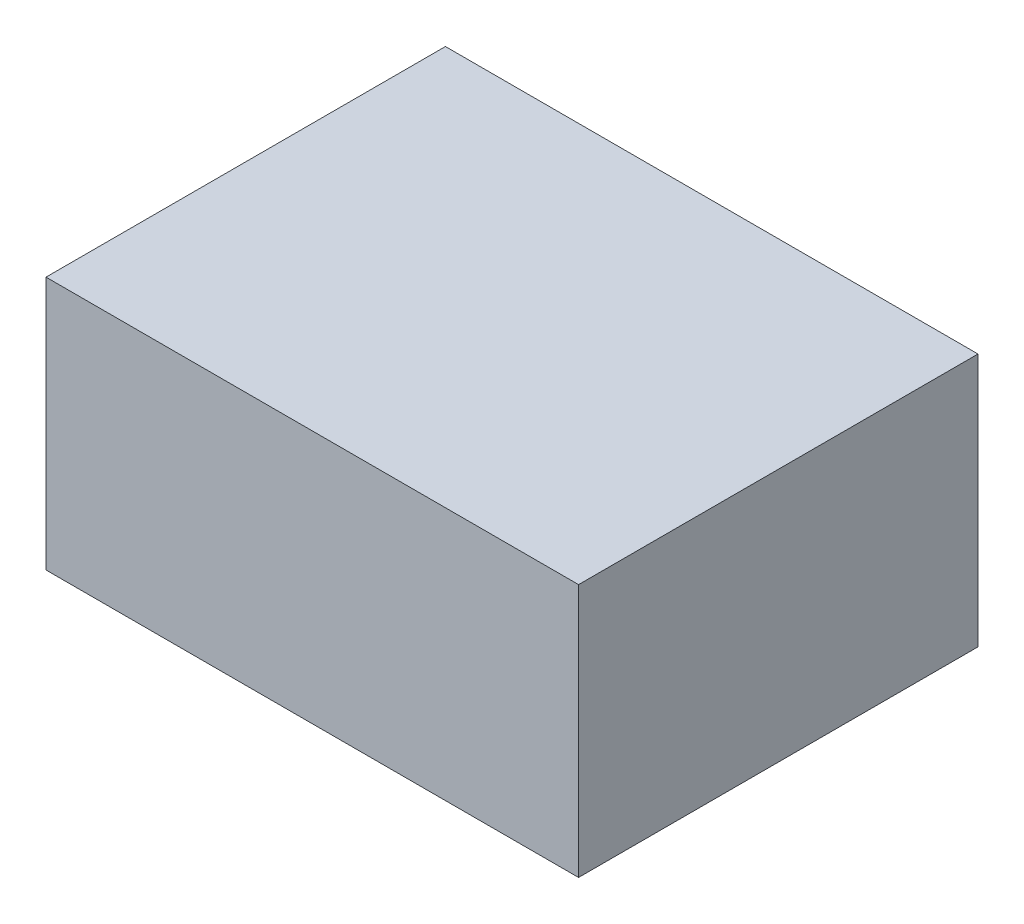
ISO-10303-21;
HEADER;
FILE_DESCRIPTION(('STEP AP214'),'2;1');
FILE_NAME('part.step','',(''),(''),'','','');
FILE_SCHEMA(('AUTOMOTIVE_DESIGN { 1 0 10303 214 1 1 1 1 }'));
ENDSEC;
DATA;
#1=APPLICATION_CONTEXT('core data for automotive mechanical design processes');
#2=APPLICATION_PROTOCOL_DEFINITION('international standard','automotive_design',2000,#1);
#3=PRODUCT_CONTEXT('',#1,'mechanical');
#4=PRODUCT('Part','Part','',(#3));
#5=PRODUCT_RELATED_PRODUCT_CATEGORY('part','',(#4));
#6=PRODUCT_DEFINITION_FORMATION('','',#4);
#7=PRODUCT_DEFINITION_CONTEXT('part definition',#1,'design');
#8=PRODUCT_DEFINITION('design','',#6,#7);
#9=PRODUCT_DEFINITION_SHAPE('','',#8);
#10=(LENGTH_UNIT() NAMED_UNIT(*) SI_UNIT(.MILLI.,.METRE.));
#11=(NAMED_UNIT(*) PLANE_ANGLE_UNIT() SI_UNIT($,.RADIAN.));
#12=(NAMED_UNIT(*) SI_UNIT($,.STERADIAN.) SOLID_ANGLE_UNIT());
#13=UNCERTAINTY_MEASURE_WITH_UNIT(LENGTH_MEASURE(1.E-05),#10,'distance_accuracy_value','');
#14=(GEOMETRIC_REPRESENTATION_CONTEXT(3) GLOBAL_UNCERTAINTY_ASSIGNED_CONTEXT((#13)) GLOBAL_UNIT_ASSIGNED_CONTEXT((#10,
#11,#12)) REPRESENTATION_CONTEXT('',''));
#15=CARTESIAN_POINT('',(0.,0.,0.));
#16=DIRECTION('',(0.,0.,1.));
#17=DIRECTION('',(1.,0.,0.));
#18=AXIS2_PLACEMENT_3D('',#15,#16,#17);
#19=CARTESIAN_POINT('',(-80.,76.2,-60.));
#20=DIRECTION('',(1.,0.,0.));
#21=DIRECTION('',(0.,0.,-1.));
#22=AXIS2_PLACEMENT_3D('',#19,#20,#21);
#23=PLANE('',#22);
#24=DIRECTION('',(0.,0.,1.));
#25=VECTOR('',#24,1.);
#26=CARTESIAN_POINT('',(-80.,0.,-60.));
#27=LINE('',#26,#25);
#28=CARTESIAN_POINT('',(-80.,0.,-60.));
#29=VERTEX_POINT('',#28);
#30=CARTESIAN_POINT('',(-80.,0.,60.));
#31=VERTEX_POINT('',#30);
#32=EDGE_CURVE('E96',#29,#31,#27,.T.);
#33=ORIENTED_EDGE('',*,*,#32,.T.);
#34=DIRECTION('',(0.,-1.,0.));
#35=VECTOR('',#34,1.);
#36=CARTESIAN_POINT('',(-80.,76.2,60.));
#37=LINE('',#36,#35);
#38=CARTESIAN_POINT('',(-80.,76.2,60.));
#39=VERTEX_POINT('',#38);
#40=EDGE_CURVE('E11',#39,#31,#37,.T.);
#41=ORIENTED_EDGE('',*,*,#40,.F.);
#42=DIRECTION('',(0.,0.,1.));
#43=VECTOR('',#42,1.);
#44=CARTESIAN_POINT('',(-80.,76.2,-60.));
#45=LINE('',#44,#43);
#46=CARTESIAN_POINT('',(-80.,76.2,-60.));
#47=VERTEX_POINT('',#46);
#48=EDGE_CURVE('E84',#47,#39,#45,.T.);
#49=ORIENTED_EDGE('',*,*,#48,.F.);
#50=DIRECTION('',(0.,-1.,0.));
#51=VECTOR('',#50,1.);
#52=CARTESIAN_POINT('',(-80.,76.2,-60.));
#53=LINE('',#52,#51);
#54=EDGE_CURVE('E92',#47,#29,#53,.T.);
#55=ORIENTED_EDGE('',*,*,#54,.T.);
#56=EDGE_LOOP('',(#33,#41,#49,#55));
#57=FACE_BOUND('',#56,.T.);
#58=ADVANCED_FACE('F33',(#57),#23,.F.);
#59=CARTESIAN_POINT('',(80.,76.2,60.));
#60=DIRECTION('',(0.,0.,-1.));
#61=DIRECTION('',(-1.,0.,0.));
#62=AXIS2_PLACEMENT_3D('',#59,#60,#61);
#63=PLANE('',#62);
#64=DIRECTION('',(1.,0.,0.));
#65=VECTOR('',#64,1.);
#66=CARTESIAN_POINT('',(80.,0.,60.));
#67=LINE('',#66,#65);
#68=CARTESIAN_POINT('',(80.,0.,60.));
#69=VERTEX_POINT('',#68);
#70=EDGE_CURVE('E88',#31,#69,#67,.T.);
#71=ORIENTED_EDGE('',*,*,#70,.T.);
#72=DIRECTION('',(0.,-1.,0.));
#73=VECTOR('',#72,1.);
#74=CARTESIAN_POINT('',(80.,76.2,60.));
#75=LINE('',#74,#73);
#76=CARTESIAN_POINT('',(80.,76.2,60.));
#77=VERTEX_POINT('',#76);
#78=EDGE_CURVE('E41',#77,#69,#75,.T.);
#79=ORIENTED_EDGE('',*,*,#78,.F.);
#80=DIRECTION('',(1.,0.,0.));
#81=VECTOR('',#80,1.);
#82=CARTESIAN_POINT('',(80.,76.2,60.));
#83=LINE('',#82,#81);
#84=EDGE_CURVE('E79',#39,#77,#83,.T.);
#85=ORIENTED_EDGE('',*,*,#84,.F.);
#86=ORIENTED_EDGE('',*,*,#40,.T.);
#87=EDGE_LOOP('',(#71,#79,#85,#86));
#88=FACE_BOUND('',#87,.T.);
#89=ADVANCED_FACE('F87',(#88),#63,.F.);
#90=CARTESIAN_POINT('',(80.,76.2,-60.));
#91=DIRECTION('',(-1.,0.,0.));
#92=DIRECTION('',(0.,0.,1.));
#93=AXIS2_PLACEMENT_3D('',#90,#91,#92);
#94=PLANE('',#93);
#95=DIRECTION('',(0.,0.,-1.));
#96=VECTOR('',#95,1.);
#97=CARTESIAN_POINT('',(80.,0.,-60.));
#98=LINE('',#97,#96);
#99=CARTESIAN_POINT('',(80.,0.,-60.));
#100=VERTEX_POINT('',#99);
#101=EDGE_CURVE('E66',#69,#100,#98,.T.);
#102=ORIENTED_EDGE('',*,*,#101,.T.);
#103=DIRECTION('',(0.,-1.,0.));
#104=VECTOR('',#103,1.);
#105=CARTESIAN_POINT('',(80.,76.2,-60.));
#106=LINE('',#105,#104);
#107=CARTESIAN_POINT('',(80.,76.2,-60.));
#108=VERTEX_POINT('',#107);
#109=EDGE_CURVE('E89',#108,#100,#106,.T.);
#110=ORIENTED_EDGE('',*,*,#109,.F.);
#111=DIRECTION('',(0.,0.,-1.));
#112=VECTOR('',#111,1.);
#113=CARTESIAN_POINT('',(80.,76.2,-60.));
#114=LINE('',#113,#112);
#115=EDGE_CURVE('E82',#77,#108,#114,.T.);
#116=ORIENTED_EDGE('',*,*,#115,.F.);
#117=ORIENTED_EDGE('',*,*,#78,.T.);
#118=EDGE_LOOP('',(#102,#110,#116,#117));
#119=FACE_BOUND('',#118,.T.);
#120=ADVANCED_FACE('F90',(#119),#94,.F.);
#121=CARTESIAN_POINT('',(80.,76.2,-60.));
#122=DIRECTION('',(0.,0.,1.));
#123=DIRECTION('',(1.,0.,0.));
#124=AXIS2_PLACEMENT_3D('',#121,#122,#123);
#125=PLANE('',#124);
#126=DIRECTION('',(-1.,0.,0.));
#127=VECTOR('',#126,1.);
#128=CARTESIAN_POINT('',(80.,0.,-60.));
#129=LINE('',#128,#127);
#130=EDGE_CURVE('E72',#100,#29,#129,.T.);
#131=ORIENTED_EDGE('',*,*,#130,.T.);
#132=ORIENTED_EDGE('',*,*,#54,.F.);
#133=DIRECTION('',(-1.,0.,0.));
#134=VECTOR('',#133,1.);
#135=CARTESIAN_POINT('',(80.,76.2,-60.));
#136=LINE('',#135,#134);
#137=EDGE_CURVE('E49',#108,#47,#136,.T.);
#138=ORIENTED_EDGE('',*,*,#137,.F.);
#139=ORIENTED_EDGE('',*,*,#109,.T.);
#140=EDGE_LOOP('',(#131,#132,#138,#139));
#141=FACE_BOUND('',#140,.T.);
#142=ADVANCED_FACE('F103',(#141),#125,.F.);
#143=CARTESIAN_POINT('',(0.,76.2,0.));
#144=DIRECTION('',(0.,-1.,0.));
#145=DIRECTION('',(0.,0.,-1.));
#146=AXIS2_PLACEMENT_3D('',#143,#144,#145);
#147=PLANE('',#146);
#148=ORIENTED_EDGE('',*,*,#48,.T.);
#149=ORIENTED_EDGE('',*,*,#84,.T.);
#150=ORIENTED_EDGE('',*,*,#115,.T.);
#151=ORIENTED_EDGE('',*,*,#137,.T.);
#152=EDGE_LOOP('',(#148,#149,#150,#151));
#153=FACE_BOUND('',#152,.T.);
#154=ADVANCED_FACE('F80',(#153),#147,.F.);
#155=CARTESIAN_POINT('',(0.,0.,0.));
#156=DIRECTION('',(0.,-1.,0.));
#157=DIRECTION('',(0.,0.,-1.));
#158=AXIS2_PLACEMENT_3D('',#155,#156,#157);
#159=PLANE('',#158);
#160=ORIENTED_EDGE('',*,*,#32,.F.);
#161=ORIENTED_EDGE('',*,*,#130,.F.);
#162=ORIENTED_EDGE('',*,*,#101,.F.);
#163=ORIENTED_EDGE('',*,*,#70,.F.);
#164=EDGE_LOOP('',(#160,#161,#162,#163));
#165=FACE_BOUND('',#164,.T.);
#166=ADVANCED_FACE('F106',(#165),#159,.T.);
#167=CLOSED_SHELL('',(#58,#89,#120,#142,#154,#166));
#168=MANIFOLD_SOLID_BREP('B2',#167);
#169=ADVANCED_BREP_SHAPE_REPRESENTATION('',(#18,#168),#14);
#170=SHAPE_DEFINITION_REPRESENTATION(#9,#169);
ENDSEC;
END-ISO-10303-21;
